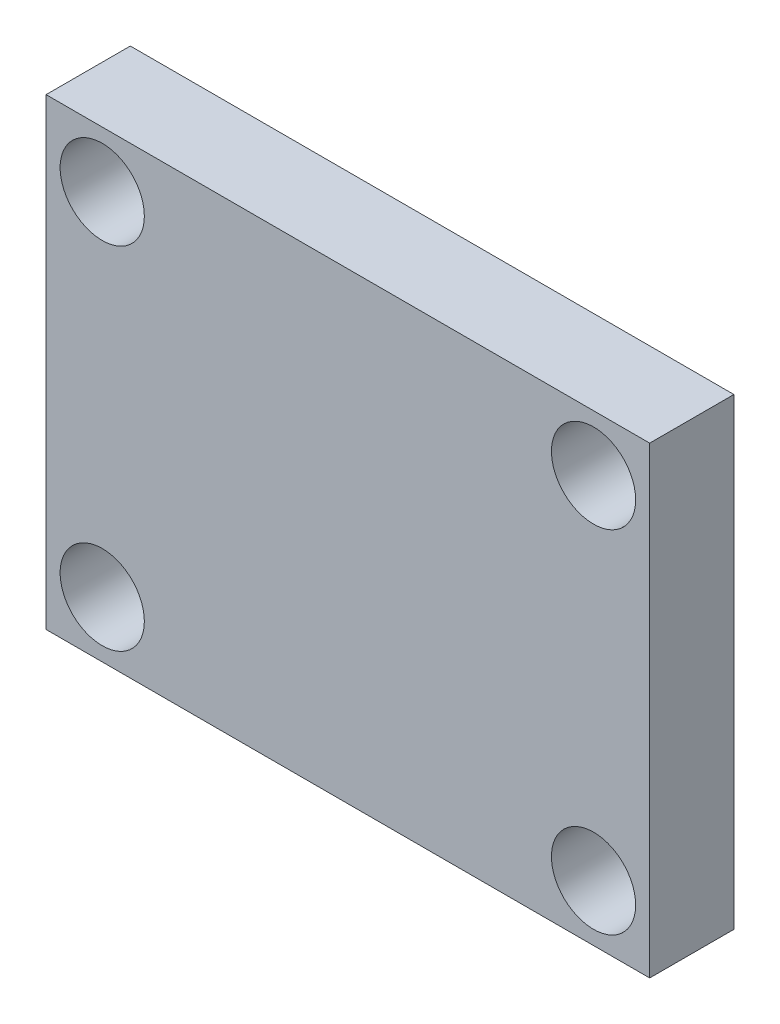
ISO-10303-21;
HEADER;
FILE_DESCRIPTION(('STEP AP214'),'2;1');
FILE_NAME('part.step','',(''),(''),'','','');
FILE_SCHEMA(('AUTOMOTIVE_DESIGN { 1 0 10303 214 1 1 1 1 }'));
ENDSEC;
DATA;
#1=APPLICATION_CONTEXT('core data for automotive mechanical design processes');
#2=APPLICATION_PROTOCOL_DEFINITION('international standard','automotive_design',2000,#1);
#3=PRODUCT_CONTEXT('',#1,'mechanical');
#4=PRODUCT('Part','Part','',(#3));
#5=PRODUCT_RELATED_PRODUCT_CATEGORY('part','',(#4));
#6=PRODUCT_DEFINITION_FORMATION('','',#4);
#7=PRODUCT_DEFINITION_CONTEXT('part definition',#1,'design');
#8=PRODUCT_DEFINITION('design','',#6,#7);
#9=PRODUCT_DEFINITION_SHAPE('','',#8);
#10=(LENGTH_UNIT() NAMED_UNIT(*) SI_UNIT(.MILLI.,.METRE.));
#11=(NAMED_UNIT(*) PLANE_ANGLE_UNIT() SI_UNIT($,.RADIAN.));
#12=(NAMED_UNIT(*) SI_UNIT($,.STERADIAN.) SOLID_ANGLE_UNIT());
#13=UNCERTAINTY_MEASURE_WITH_UNIT(LENGTH_MEASURE(1.E-05),#10,'distance_accuracy_value','');
#14=(GEOMETRIC_REPRESENTATION_CONTEXT(3) GLOBAL_UNCERTAINTY_ASSIGNED_CONTEXT((#13)) GLOBAL_UNIT_ASSIGNED_CONTEXT((#10,
#11,#12)) REPRESENTATION_CONTEXT('',''));
#15=CARTESIAN_POINT('',(0.,0.,0.));
#16=DIRECTION('',(0.,0.,1.));
#17=DIRECTION('',(1.,0.,0.));
#18=AXIS2_PLACEMENT_3D('',#15,#16,#17);
#19=CARTESIAN_POINT('',(0.,0.,3.));
#20=DIRECTION('',(0.,0.,-1.));
#21=DIRECTION('',(-1.,0.,0.));
#22=AXIS2_PLACEMENT_3D('',#19,#20,#21);
#23=PLANE('',#22);
#24=DIRECTION('',(0.,1.,0.));
#25=VECTOR('',#24,1.);
#26=CARTESIAN_POINT('',(10.75,-8.25,3.));
#27=LINE('',#26,#25);
#28=CARTESIAN_POINT('',(10.75,-8.25,3.));
#29=VERTEX_POINT('',#28);
#30=CARTESIAN_POINT('',(10.75,8.25,3.));
#31=VERTEX_POINT('',#30);
#32=EDGE_CURVE('E96',#29,#31,#27,.T.);
#33=ORIENTED_EDGE('',*,*,#32,.T.);
#34=DIRECTION('',(-1.,0.,0.));
#35=VECTOR('',#34,1.);
#36=CARTESIAN_POINT('',(-10.75,8.25,3.));
#37=LINE('',#36,#35);
#38=CARTESIAN_POINT('',(-10.75,8.25,3.));
#39=VERTEX_POINT('',#38);
#40=EDGE_CURVE('E91',#31,#39,#37,.T.);
#41=ORIENTED_EDGE('',*,*,#40,.T.);
#42=DIRECTION('',(0.,-1.,0.));
#43=VECTOR('',#42,1.);
#44=CARTESIAN_POINT('',(-10.75,-8.25,3.));
#45=LINE('',#44,#43);
#46=CARTESIAN_POINT('',(-10.75,-8.25,3.));
#47=VERTEX_POINT('',#46);
#48=EDGE_CURVE('E94',#39,#47,#45,.T.);
#49=ORIENTED_EDGE('',*,*,#48,.T.);
#50=DIRECTION('',(1.,0.,0.));
#51=VECTOR('',#50,1.);
#52=CARTESIAN_POINT('',(-10.75,-8.25,3.));
#53=LINE('',#52,#51);
#54=EDGE_CURVE('E61',#47,#29,#53,.T.);
#55=ORIENTED_EDGE('',*,*,#54,.T.);
#56=EDGE_LOOP('',(#33,#41,#49,#55));
#57=FACE_BOUND('',#56,.T.);
#58=CARTESIAN_POINT('',(-8.75,6.25,3.));
#59=DIRECTION('',(0.,0.,1.));
#60=DIRECTION('',(1.,0.,0.));
#61=AXIS2_PLACEMENT_3D('',#58,#59,#60);
#62=CIRCLE('',#61,1.5);
#63=CARTESIAN_POINT('',(-7.25,6.25,3.));
#64=VERTEX_POINT('',#63);
#65=EDGE_CURVE('E116',#64,#64,#62,.T.);
#66=ORIENTED_EDGE('',*,*,#65,.F.);
#67=EDGE_LOOP('',(#66));
#68=FACE_BOUND('',#67,.T.);
#69=CARTESIAN_POINT('',(8.75,6.25,3.));
#70=DIRECTION('',(0.,0.,1.));
#71=DIRECTION('',(1.,0.,0.));
#72=AXIS2_PLACEMENT_3D('',#69,#70,#71);
#73=CIRCLE('',#72,1.5);
#74=CARTESIAN_POINT('',(10.25,6.25,3.));
#75=VERTEX_POINT('',#74);
#76=EDGE_CURVE('E138',#75,#75,#73,.T.);
#77=ORIENTED_EDGE('',*,*,#76,.F.);
#78=EDGE_LOOP('',(#77));
#79=FACE_BOUND('',#78,.T.);
#80=CARTESIAN_POINT('',(8.75,-6.25,3.));
#81=DIRECTION('',(0.,0.,1.));
#82=DIRECTION('',(1.,0.,0.));
#83=AXIS2_PLACEMENT_3D('',#80,#81,#82);
#84=CIRCLE('',#83,1.5);
#85=CARTESIAN_POINT('',(10.25,-6.25,3.));
#86=VERTEX_POINT('',#85);
#87=EDGE_CURVE('E146',#86,#86,#84,.T.);
#88=ORIENTED_EDGE('',*,*,#87,.F.);
#89=EDGE_LOOP('',(#88));
#90=FACE_BOUND('',#89,.T.);
#91=CARTESIAN_POINT('',(-8.75,-6.25,3.));
#92=DIRECTION('',(0.,0.,1.));
#93=DIRECTION('',(1.,0.,0.));
#94=AXIS2_PLACEMENT_3D('',#91,#92,#93);
#95=CIRCLE('',#94,1.5);
#96=CARTESIAN_POINT('',(-7.25,-6.25,3.));
#97=VERTEX_POINT('',#96);
#98=EDGE_CURVE('E154',#97,#97,#95,.T.);
#99=ORIENTED_EDGE('',*,*,#98,.F.);
#100=EDGE_LOOP('',(#99));
#101=FACE_BOUND('',#100,.T.);
#102=ADVANCED_FACE('F43',(#57,#68,#79,#90,#101),#23,.F.);
#103=CARTESIAN_POINT('',(0.,0.,0.));
#104=DIRECTION('',(0.,0.,-1.));
#105=DIRECTION('',(-1.,0.,0.));
#106=AXIS2_PLACEMENT_3D('',#103,#104,#105);
#107=PLANE('',#106);
#108=CARTESIAN_POINT('',(8.75,-6.25,0.));
#109=DIRECTION('',(0.,0.,1.));
#110=DIRECTION('',(1.,0.,0.));
#111=AXIS2_PLACEMENT_3D('',#108,#109,#110);
#112=CIRCLE('',#111,1.5);
#113=CARTESIAN_POINT('',(10.25,-6.25,0.));
#114=VERTEX_POINT('',#113);
#115=EDGE_CURVE('E150',#114,#114,#112,.T.);
#116=ORIENTED_EDGE('',*,*,#115,.T.);
#117=EDGE_LOOP('',(#116));
#118=FACE_BOUND('',#117,.T.);
#119=CARTESIAN_POINT('',(-8.75,6.25,0.));
#120=DIRECTION('',(0.,0.,1.));
#121=DIRECTION('',(1.,0.,0.));
#122=AXIS2_PLACEMENT_3D('',#119,#120,#121);
#123=CIRCLE('',#122,1.5);
#124=CARTESIAN_POINT('',(-7.25,6.25,0.));
#125=VERTEX_POINT('',#124);
#126=EDGE_CURVE('E134',#125,#125,#123,.T.);
#127=ORIENTED_EDGE('',*,*,#126,.T.);
#128=EDGE_LOOP('',(#127));
#129=FACE_BOUND('',#128,.T.);
#130=DIRECTION('',(0.,1.,0.));
#131=VECTOR('',#130,1.);
#132=CARTESIAN_POINT('',(10.75,-8.25,0.));
#133=LINE('',#132,#131);
#134=CARTESIAN_POINT('',(10.75,-8.25,0.));
#135=VERTEX_POINT('',#134);
#136=CARTESIAN_POINT('',(10.75,8.25,0.));
#137=VERTEX_POINT('',#136);
#138=EDGE_CURVE('E112',#135,#137,#133,.T.);
#139=ORIENTED_EDGE('',*,*,#138,.F.);
#140=DIRECTION('',(1.,0.,0.));
#141=VECTOR('',#140,1.);
#142=CARTESIAN_POINT('',(-10.75,-8.25,0.));
#143=LINE('',#142,#141);
#144=CARTESIAN_POINT('',(-10.75,-8.25,0.));
#145=VERTEX_POINT('',#144);
#146=EDGE_CURVE('E84',#145,#135,#143,.T.);
#147=ORIENTED_EDGE('',*,*,#146,.F.);
#148=DIRECTION('',(0.,-1.,0.));
#149=VECTOR('',#148,1.);
#150=CARTESIAN_POINT('',(-10.75,-8.25,0.));
#151=LINE('',#150,#149);
#152=CARTESIAN_POINT('',(-10.75,8.25,0.));
#153=VERTEX_POINT('',#152);
#154=EDGE_CURVE('E78',#153,#145,#151,.T.);
#155=ORIENTED_EDGE('',*,*,#154,.F.);
#156=DIRECTION('',(-1.,0.,0.));
#157=VECTOR('',#156,1.);
#158=CARTESIAN_POINT('',(-10.75,8.25,0.));
#159=LINE('',#158,#157);
#160=EDGE_CURVE('E101',#137,#153,#159,.T.);
#161=ORIENTED_EDGE('',*,*,#160,.F.);
#162=EDGE_LOOP('',(#139,#147,#155,#161));
#163=FACE_BOUND('',#162,.T.);
#164=CARTESIAN_POINT('',(8.75,6.25,0.));
#165=DIRECTION('',(0.,0.,1.));
#166=DIRECTION('',(1.,0.,0.));
#167=AXIS2_PLACEMENT_3D('',#164,#165,#166);
#168=CIRCLE('',#167,1.5);
#169=CARTESIAN_POINT('',(10.25,6.25,0.));
#170=VERTEX_POINT('',#169);
#171=EDGE_CURVE('E142',#170,#170,#168,.T.);
#172=ORIENTED_EDGE('',*,*,#171,.T.);
#173=EDGE_LOOP('',(#172));
#174=FACE_BOUND('',#173,.T.);
#175=CARTESIAN_POINT('',(-8.75,-6.25,0.));
#176=DIRECTION('',(0.,0.,1.));
#177=DIRECTION('',(1.,0.,0.));
#178=AXIS2_PLACEMENT_3D('',#175,#176,#177);
#179=CIRCLE('',#178,1.5);
#180=CARTESIAN_POINT('',(-7.25,-6.25,0.));
#181=VERTEX_POINT('',#180);
#182=EDGE_CURVE('E158',#181,#181,#179,.T.);
#183=ORIENTED_EDGE('',*,*,#182,.T.);
#184=EDGE_LOOP('',(#183));
#185=FACE_BOUND('',#184,.T.);
#186=ADVANCED_FACE('F129',(#118,#129,#163,#174,#185),#107,.T.);
#187=CARTESIAN_POINT('',(10.75,-8.25,3.));
#188=DIRECTION('',(-1.,0.,0.));
#189=DIRECTION('',(0.,0.,1.));
#190=AXIS2_PLACEMENT_3D('',#187,#188,#189);
#191=PLANE('',#190);
#192=ORIENTED_EDGE('',*,*,#138,.T.);
#193=DIRECTION('',(0.,0.,-1.));
#194=VECTOR('',#193,1.);
#195=CARTESIAN_POINT('',(10.75,8.25,3.));
#196=LINE('',#195,#194);
#197=EDGE_CURVE('E11',#31,#137,#196,.T.);
#198=ORIENTED_EDGE('',*,*,#197,.F.);
#199=ORIENTED_EDGE('',*,*,#32,.F.);
#200=DIRECTION('',(0.,0.,-1.));
#201=VECTOR('',#200,1.);
#202=CARTESIAN_POINT('',(10.75,-8.25,3.));
#203=LINE('',#202,#201);
#204=EDGE_CURVE('E108',#29,#135,#203,.T.);
#205=ORIENTED_EDGE('',*,*,#204,.T.);
#206=EDGE_LOOP('',(#192,#198,#199,#205));
#207=FACE_BOUND('',#206,.T.);
#208=ADVANCED_FACE('F45',(#207),#191,.F.);
#209=CARTESIAN_POINT('',(-10.75,8.25,3.));
#210=DIRECTION('',(0.,-1.,0.));
#211=DIRECTION('',(0.,0.,-1.));
#212=AXIS2_PLACEMENT_3D('',#209,#210,#211);
#213=PLANE('',#212);
#214=ORIENTED_EDGE('',*,*,#160,.T.);
#215=DIRECTION('',(0.,0.,-1.));
#216=VECTOR('',#215,1.);
#217=CARTESIAN_POINT('',(-10.75,8.25,3.));
#218=LINE('',#217,#216);
#219=EDGE_CURVE('E53',#39,#153,#218,.T.);
#220=ORIENTED_EDGE('',*,*,#219,.F.);
#221=ORIENTED_EDGE('',*,*,#40,.F.);
#222=ORIENTED_EDGE('',*,*,#197,.T.);
#223=EDGE_LOOP('',(#214,#220,#221,#222));
#224=FACE_BOUND('',#223,.T.);
#225=ADVANCED_FACE('F100',(#224),#213,.F.);
#226=CARTESIAN_POINT('',(-10.75,-8.25,3.));
#227=DIRECTION('',(1.,0.,0.));
#228=DIRECTION('',(0.,0.,-1.));
#229=AXIS2_PLACEMENT_3D('',#226,#227,#228);
#230=PLANE('',#229);
#231=ORIENTED_EDGE('',*,*,#154,.T.);
#232=DIRECTION('',(0.,0.,-1.));
#233=VECTOR('',#232,1.);
#234=CARTESIAN_POINT('',(-10.75,-8.25,3.));
#235=LINE('',#234,#233);
#236=EDGE_CURVE('E103',#47,#145,#235,.T.);
#237=ORIENTED_EDGE('',*,*,#236,.F.);
#238=ORIENTED_EDGE('',*,*,#48,.F.);
#239=ORIENTED_EDGE('',*,*,#219,.T.);
#240=EDGE_LOOP('',(#231,#237,#238,#239));
#241=FACE_BOUND('',#240,.T.);
#242=ADVANCED_FACE('F104',(#241),#230,.F.);
#243=CARTESIAN_POINT('',(-10.75,-8.25,3.));
#244=DIRECTION('',(0.,1.,0.));
#245=DIRECTION('',(0.,0.,1.));
#246=AXIS2_PLACEMENT_3D('',#243,#244,#245);
#247=PLANE('',#246);
#248=ORIENTED_EDGE('',*,*,#146,.T.);
#249=ORIENTED_EDGE('',*,*,#204,.F.);
#250=ORIENTED_EDGE('',*,*,#54,.F.);
#251=ORIENTED_EDGE('',*,*,#236,.T.);
#252=EDGE_LOOP('',(#248,#249,#250,#251));
#253=FACE_BOUND('',#252,.T.);
#254=ADVANCED_FACE('F126',(#253),#247,.F.);
#255=CARTESIAN_POINT('',(-8.75,6.25,3.));
#256=DIRECTION('',(0.,0.,-1.));
#257=DIRECTION('',(-1.,0.,0.));
#258=AXIS2_PLACEMENT_3D('',#255,#256,#257);
#259=CYLINDRICAL_SURFACE('',#258,1.5);
#260=ORIENTED_EDGE('',*,*,#65,.T.);
#261=EDGE_LOOP('',(#260));
#262=FACE_BOUND('',#261,.T.);
#263=ORIENTED_EDGE('',*,*,#126,.F.);
#264=EDGE_LOOP('',(#263));
#265=FACE_BOUND('',#264,.T.);
#266=ADVANCED_FACE('F177',(#262,#265),#259,.F.);
#267=CARTESIAN_POINT('',(8.75,6.25,3.));
#268=DIRECTION('',(0.,0.,-1.));
#269=DIRECTION('',(-1.,0.,0.));
#270=AXIS2_PLACEMENT_3D('',#267,#268,#269);
#271=CYLINDRICAL_SURFACE('',#270,1.5);
#272=ORIENTED_EDGE('',*,*,#76,.T.);
#273=EDGE_LOOP('',(#272));
#274=FACE_BOUND('',#273,.T.);
#275=ORIENTED_EDGE('',*,*,#171,.F.);
#276=EDGE_LOOP('',(#275));
#277=FACE_BOUND('',#276,.T.);
#278=ADVANCED_FACE('F231',(#274,#277),#271,.F.);
#279=CARTESIAN_POINT('',(8.75,-6.25,3.));
#280=DIRECTION('',(0.,0.,-1.));
#281=DIRECTION('',(-1.,0.,0.));
#282=AXIS2_PLACEMENT_3D('',#279,#280,#281);
#283=CYLINDRICAL_SURFACE('',#282,1.5);
#284=ORIENTED_EDGE('',*,*,#87,.T.);
#285=EDGE_LOOP('',(#284));
#286=FACE_BOUND('',#285,.T.);
#287=ORIENTED_EDGE('',*,*,#115,.F.);
#288=EDGE_LOOP('',(#287));
#289=FACE_BOUND('',#288,.T.);
#290=ADVANCED_FACE('F240',(#286,#289),#283,.F.);
#291=CARTESIAN_POINT('',(-8.75,-6.25,3.));
#292=DIRECTION('',(0.,0.,-1.));
#293=DIRECTION('',(-1.,0.,0.));
#294=AXIS2_PLACEMENT_3D('',#291,#292,#293);
#295=CYLINDRICAL_SURFACE('',#294,1.5);
#296=ORIENTED_EDGE('',*,*,#98,.T.);
#297=EDGE_LOOP('',(#296));
#298=FACE_BOUND('',#297,.T.);
#299=ORIENTED_EDGE('',*,*,#182,.F.);
#300=EDGE_LOOP('',(#299));
#301=FACE_BOUND('',#300,.T.);
#302=ADVANCED_FACE('F166',(#298,#301),#295,.F.);
#303=CLOSED_SHELL('',(#102,#186,#208,#225,#242,#254,#266,#278,#290,#302));
#304=MANIFOLD_SOLID_BREP('B2',#303);
#305=ADVANCED_BREP_SHAPE_REPRESENTATION('',(#18,#304),#14);
#306=SHAPE_DEFINITION_REPRESENTATION(#9,#305);
ENDSEC;
END-ISO-10303-21;
